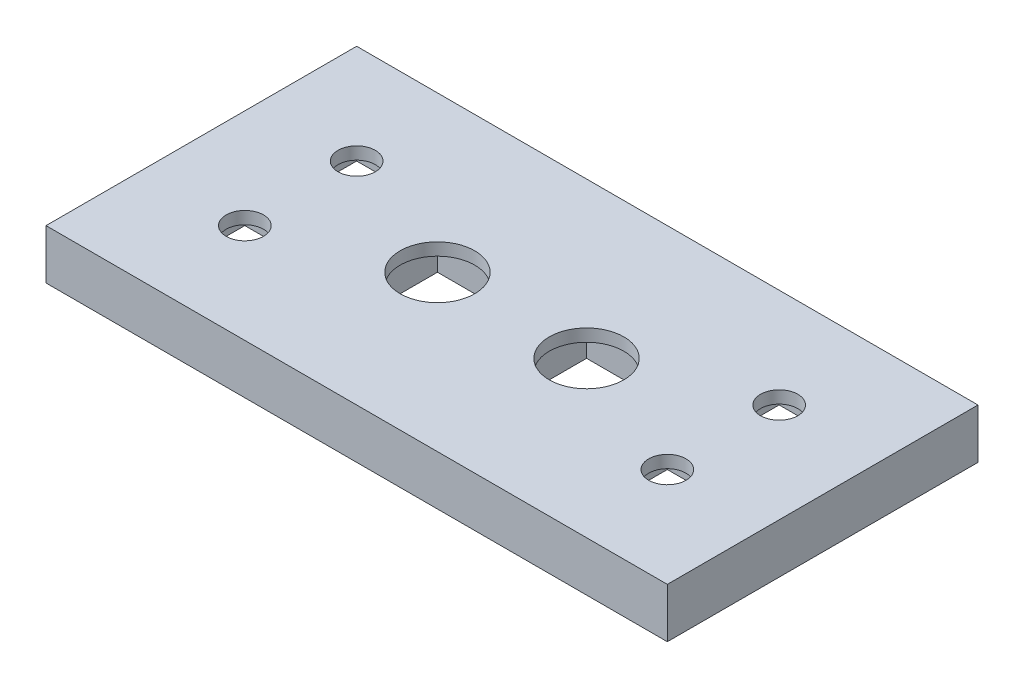
ISO-10303-21;
HEADER;
FILE_DESCRIPTION(('STEP AP214'),'2;1');
FILE_NAME('part.step','',(''),(''),'','','');
FILE_SCHEMA(('AUTOMOTIVE_DESIGN { 1 0 10303 214 1 1 1 1 }'));
ENDSEC;
DATA;
#1=APPLICATION_CONTEXT('core data for automotive mechanical design processes');
#2=APPLICATION_PROTOCOL_DEFINITION('international standard','automotive_design',2000,#1);
#3=PRODUCT_CONTEXT('',#1,'mechanical');
#4=PRODUCT('Part','Part','',(#3));
#5=PRODUCT_RELATED_PRODUCT_CATEGORY('part','',(#4));
#6=PRODUCT_DEFINITION_FORMATION('','',#4);
#7=PRODUCT_DEFINITION_CONTEXT('part definition',#1,'design');
#8=PRODUCT_DEFINITION('design','',#6,#7);
#9=PRODUCT_DEFINITION_SHAPE('','',#8);
#10=(LENGTH_UNIT() NAMED_UNIT(*) SI_UNIT(.MILLI.,.METRE.));
#11=(NAMED_UNIT(*) PLANE_ANGLE_UNIT() SI_UNIT($,.RADIAN.));
#12=(NAMED_UNIT(*) SI_UNIT($,.STERADIAN.) SOLID_ANGLE_UNIT());
#13=UNCERTAINTY_MEASURE_WITH_UNIT(LENGTH_MEASURE(1.E-05),#10,'distance_accuracy_value','');
#14=(GEOMETRIC_REPRESENTATION_CONTEXT(3) GLOBAL_UNCERTAINTY_ASSIGNED_CONTEXT((#13)) GLOBAL_UNIT_ASSIGNED_CONTEXT((#10,
#11,#12)) REPRESENTATION_CONTEXT('',''));
#15=CARTESIAN_POINT('',(0.,0.,0.));
#16=DIRECTION('',(0.,0.,1.));
#17=DIRECTION('',(1.,0.,0.));
#18=AXIS2_PLACEMENT_3D('',#15,#16,#17);
#19=CARTESIAN_POINT('',(0.,4.,0.));
#20=DIRECTION('',(0.,-1.,0.));
#21=DIRECTION('',(0.,0.,-1.));
#22=AXIS2_PLACEMENT_3D('',#19,#20,#21);
#23=PLANE('',#22);
#24=CARTESIAN_POINT('',(31.,4.,-12.5));
#25=DIRECTION('',(0.,-1.,0.));
#26=DIRECTION('',(0.,0.,-1.));
#27=AXIS2_PLACEMENT_3D('',#24,#25,#26);
#28=CIRCLE('',#27,3.);
#29=CARTESIAN_POINT('',(31.,4.,-15.5));
#30=VERTEX_POINT('',#29);
#31=EDGE_CURVE('E635',#30,#30,#28,.T.);
#32=ORIENTED_EDGE('',*,*,#31,.T.);
#33=EDGE_LOOP('',(#32));
#34=FACE_BOUND('',#33,.T.);
#35=CARTESIAN_POINT('',(42.,4.,-8.));
#36=DIRECTION('',(0.,1.,0.));
#37=DIRECTION('',(0.,0.,1.));
#38=AXIS2_PLACEMENT_3D('',#35,#36,#37);
#39=CIRCLE('',#38,1.5);
#40=CARTESIAN_POINT('',(42.,4.,-6.5));
#41=VERTEX_POINT('',#40);
#42=EDGE_CURVE('E1064',#41,#41,#39,.T.);
#43=ORIENTED_EDGE('',*,*,#42,.F.);
#44=EDGE_LOOP('',(#43));
#45=FACE_BOUND('',#44,.T.);
#46=DIRECTION('',(0.,0.,-1.));
#47=VECTOR('',#46,1.);
#48=CARTESIAN_POINT('',(0.,4.,0.));
#49=LINE('',#48,#47);
#50=CARTESIAN_POINT('',(0.,4.,0.));
#51=VERTEX_POINT('',#50);
#52=CARTESIAN_POINT('',(0.,4.,-25.));
#53=VERTEX_POINT('',#52);
#54=EDGE_CURVE('E487',#51,#53,#49,.T.);
#55=ORIENTED_EDGE('',*,*,#54,.F.);
#56=DIRECTION('',(1.,0.,0.));
#57=VECTOR('',#56,1.);
#58=CARTESIAN_POINT('',(0.,4.,0.));
#59=LINE('',#58,#57);
#60=CARTESIAN_POINT('',(50.,4.,0.));
#61=VERTEX_POINT('',#60);
#62=EDGE_CURVE('E499',#51,#61,#59,.T.);
#63=ORIENTED_EDGE('',*,*,#62,.T.);
#64=DIRECTION('',(0.,0.,-1.));
#65=VECTOR('',#64,1.);
#66=CARTESIAN_POINT('',(50.,4.,0.));
#67=LINE('',#66,#65);
#68=CARTESIAN_POINT('',(50.,4.,-25.));
#69=VERTEX_POINT('',#68);
#70=EDGE_CURVE('E496',#61,#69,#67,.T.);
#71=ORIENTED_EDGE('',*,*,#70,.T.);
#72=DIRECTION('',(1.,0.,0.));
#73=VECTOR('',#72,1.);
#74=CARTESIAN_POINT('',(0.,4.,-25.));
#75=LINE('',#74,#73);
#76=EDGE_CURVE('E491',#53,#69,#75,.T.);
#77=ORIENTED_EDGE('',*,*,#76,.F.);
#78=EDGE_LOOP('',(#55,#63,#71,#77));
#79=FACE_BOUND('',#78,.T.);
#80=CARTESIAN_POINT('',(8.,4.,-17.));
#81=DIRECTION('',(0.,1.,0.));
#82=DIRECTION('',(0.,0.,1.));
#83=AXIS2_PLACEMENT_3D('',#80,#81,#82);
#84=CIRCLE('',#83,1.5);
#85=CARTESIAN_POINT('',(8.,4.,-15.5));
#86=VERTEX_POINT('',#85);
#87=EDGE_CURVE('E619',#86,#86,#84,.T.);
#88=ORIENTED_EDGE('',*,*,#87,.F.);
#89=EDGE_LOOP('',(#88));
#90=FACE_BOUND('',#89,.T.);
#91=CARTESIAN_POINT('',(42.,4.,-17.));
#92=DIRECTION('',(0.,-1.,0.));
#93=DIRECTION('',(0.,0.,-1.));
#94=AXIS2_PLACEMENT_3D('',#91,#92,#93);
#95=CIRCLE('',#94,1.5);
#96=CARTESIAN_POINT('',(42.,4.,-18.5));
#97=VERTEX_POINT('',#96);
#98=EDGE_CURVE('E623',#97,#97,#95,.T.);
#99=ORIENTED_EDGE('',*,*,#98,.T.);
#100=EDGE_LOOP('',(#99));
#101=FACE_BOUND('',#100,.T.);
#102=CARTESIAN_POINT('',(19.,4.,-12.5));
#103=DIRECTION('',(0.,1.,0.));
#104=DIRECTION('',(0.,0.,1.));
#105=AXIS2_PLACEMENT_3D('',#102,#103,#104);
#106=CIRCLE('',#105,3.);
#107=CARTESIAN_POINT('',(19.,4.,-9.5));
#108=VERTEX_POINT('',#107);
#109=EDGE_CURVE('E627',#108,#108,#106,.T.);
#110=ORIENTED_EDGE('',*,*,#109,.F.);
#111=EDGE_LOOP('',(#110));
#112=FACE_BOUND('',#111,.T.);
#113=CARTESIAN_POINT('',(8.,4.,-8.));
#114=DIRECTION('',(0.,-1.,0.));
#115=DIRECTION('',(0.,0.,-1.));
#116=AXIS2_PLACEMENT_3D('',#113,#114,#115);
#117=CIRCLE('',#116,1.5);
#118=CARTESIAN_POINT('',(8.,4.,-9.5));
#119=VERTEX_POINT('',#118);
#120=EDGE_CURVE('E630',#119,#119,#117,.T.);
#121=ORIENTED_EDGE('',*,*,#120,.T.);
#122=EDGE_LOOP('',(#121));
#123=FACE_BOUND('',#122,.T.);
#124=ADVANCED_FACE('F39',(#34,#45,#79,#90,#101,#112,#123),#23,.F.);
#125=CARTESIAN_POINT('',(0.,0.,0.));
#126=DIRECTION('',(0.,-1.,0.));
#127=DIRECTION('',(0.,0.,-1.));
#128=AXIS2_PLACEMENT_3D('',#125,#126,#127);
#129=PLANE('',#128);
#130=DIRECTION('',(0.,0.,-1.));
#131=VECTOR('',#130,1.);
#132=CARTESIAN_POINT('',(38.,0.,0.));
#133=LINE('',#132,#131);
#134=CARTESIAN_POINT('',(38.,0.,-13.));
#135=VERTEX_POINT('',#134);
#136=CARTESIAN_POINT('',(38.,0.,-21.));
#137=VERTEX_POINT('',#136);
#138=EDGE_CURVE('E57',#135,#137,#133,.T.);
#139=ORIENTED_EDGE('',*,*,#138,.F.);
#140=DIRECTION('',(-1.,0.,0.));
#141=VECTOR('',#140,1.);
#142=CARTESIAN_POINT('',(0.,0.,-13.));
#143=LINE('',#142,#141);
#144=CARTESIAN_POINT('',(46.,0.,-13.));
#145=VERTEX_POINT('',#144);
#146=EDGE_CURVE('E298',#145,#135,#143,.T.);
#147=ORIENTED_EDGE('',*,*,#146,.F.);
#148=DIRECTION('',(0.,0.,-1.));
#149=VECTOR('',#148,1.);
#150=CARTESIAN_POINT('',(46.,0.,0.));
#151=LINE('',#150,#149);
#152=CARTESIAN_POINT('',(46.,0.,-21.));
#153=VERTEX_POINT('',#152);
#154=EDGE_CURVE('E293',#145,#153,#151,.T.);
#155=ORIENTED_EDGE('',*,*,#154,.T.);
#156=DIRECTION('',(-1.,0.,0.));
#157=VECTOR('',#156,1.);
#158=CARTESIAN_POINT('',(0.,0.,-21.));
#159=LINE('',#158,#157);
#160=EDGE_CURVE('E289',#153,#137,#159,.T.);
#161=ORIENTED_EDGE('',*,*,#160,.T.);
#162=EDGE_LOOP('',(#139,#147,#155,#161));
#163=FACE_BOUND('',#162,.T.);
#164=DIRECTION('',(-1.,0.,0.));
#165=VECTOR('',#164,1.);
#166=CARTESIAN_POINT('',(0.,0.,-8.5));
#167=LINE('',#166,#165);
#168=CARTESIAN_POINT('',(35.,0.,-8.5));
#169=VERTEX_POINT('',#168);
#170=CARTESIAN_POINT('',(27.,0.,-8.5));
#171=VERTEX_POINT('',#170);
#172=EDGE_CURVE('E65',#169,#171,#167,.T.);
#173=ORIENTED_EDGE('',*,*,#172,.F.);
#174=DIRECTION('',(0.,0.,-1.));
#175=VECTOR('',#174,1.);
#176=CARTESIAN_POINT('',(35.,0.,0.));
#177=LINE('',#176,#175);
#178=CARTESIAN_POINT('',(35.,0.,-16.5));
#179=VERTEX_POINT('',#178);
#180=EDGE_CURVE('E340',#169,#179,#177,.T.);
#181=ORIENTED_EDGE('',*,*,#180,.T.);
#182=DIRECTION('',(-1.,0.,0.));
#183=VECTOR('',#182,1.);
#184=CARTESIAN_POINT('',(0.,0.,-16.5));
#185=LINE('',#184,#183);
#186=CARTESIAN_POINT('',(27.,0.,-16.5));
#187=VERTEX_POINT('',#186);
#188=EDGE_CURVE('E335',#179,#187,#185,.T.);
#189=ORIENTED_EDGE('',*,*,#188,.T.);
#190=DIRECTION('',(0.,0.,-1.));
#191=VECTOR('',#190,1.);
#192=CARTESIAN_POINT('',(27.,0.,0.));
#193=LINE('',#192,#191);
#194=EDGE_CURVE('E331',#171,#187,#193,.T.);
#195=ORIENTED_EDGE('',*,*,#194,.F.);
#196=EDGE_LOOP('',(#173,#181,#189,#195));
#197=FACE_BOUND('',#196,.T.);
#198=DIRECTION('',(1.,0.,0.));
#199=VECTOR('',#198,1.);
#200=CARTESIAN_POINT('',(0.,0.,-12.));
#201=LINE('',#200,#199);
#202=CARTESIAN_POINT('',(4.,0.,-12.));
#203=VERTEX_POINT('',#202);
#204=CARTESIAN_POINT('',(12.,0.,-12.));
#205=VERTEX_POINT('',#204);
#206=EDGE_CURVE('E321',#203,#205,#201,.T.);
#207=ORIENTED_EDGE('',*,*,#206,.F.);
#208=DIRECTION('',(0.,0.,1.));
#209=VECTOR('',#208,1.);
#210=CARTESIAN_POINT('',(4.,0.,0.));
#211=LINE('',#210,#209);
#212=CARTESIAN_POINT('',(4.,0.,-4.));
#213=VERTEX_POINT('',#212);
#214=EDGE_CURVE('E382',#203,#213,#211,.T.);
#215=ORIENTED_EDGE('',*,*,#214,.T.);
#216=DIRECTION('',(1.,0.,0.));
#217=VECTOR('',#216,1.);
#218=CARTESIAN_POINT('',(0.,0.,-4.));
#219=LINE('',#218,#217);
#220=CARTESIAN_POINT('',(12.,0.,-4.));
#221=VERTEX_POINT('',#220);
#222=EDGE_CURVE('E377',#213,#221,#219,.T.);
#223=ORIENTED_EDGE('',*,*,#222,.T.);
#224=DIRECTION('',(0.,0.,1.));
#225=VECTOR('',#224,1.);
#226=CARTESIAN_POINT('',(12.,0.,0.));
#227=LINE('',#226,#225);
#228=EDGE_CURVE('E373',#205,#221,#227,.T.);
#229=ORIENTED_EDGE('',*,*,#228,.F.);
#230=EDGE_LOOP('',(#207,#215,#223,#229));
#231=FACE_BOUND('',#230,.T.);
#232=DIRECTION('',(-1.,0.,0.));
#233=VECTOR('',#232,1.);
#234=CARTESIAN_POINT('',(0.,0.,-4.));
#235=LINE('',#234,#233);
#236=CARTESIAN_POINT('',(46.,0.,-4.));
#237=VERTEX_POINT('',#236);
#238=CARTESIAN_POINT('',(38.,0.,-4.));
#239=VERTEX_POINT('',#238);
#240=EDGE_CURVE('E304',#237,#239,#235,.T.);
#241=ORIENTED_EDGE('',*,*,#240,.F.);
#242=DIRECTION('',(0.,0.,1.));
#243=VECTOR('',#242,1.);
#244=CARTESIAN_POINT('',(46.,0.,0.));
#245=LINE('',#244,#243);
#246=CARTESIAN_POINT('',(46.,0.,-12.));
#247=VERTEX_POINT('',#246);
#248=EDGE_CURVE('E462',#247,#237,#245,.T.);
#249=ORIENTED_EDGE('',*,*,#248,.F.);
#250=DIRECTION('',(-1.,0.,0.));
#251=VECTOR('',#250,1.);
#252=CARTESIAN_POINT('',(0.,0.,-12.));
#253=LINE('',#252,#251);
#254=CARTESIAN_POINT('',(38.,0.,-12.));
#255=VERTEX_POINT('',#254);
#256=EDGE_CURVE('E466',#247,#255,#253,.T.);
#257=ORIENTED_EDGE('',*,*,#256,.T.);
#258=DIRECTION('',(0.,0.,1.));
#259=VECTOR('',#258,1.);
#260=CARTESIAN_POINT('',(38.,0.,0.));
#261=LINE('',#260,#259);
#262=EDGE_CURVE('E448',#255,#239,#261,.T.);
#263=ORIENTED_EDGE('',*,*,#262,.T.);
#264=EDGE_LOOP('',(#241,#249,#257,#263));
#265=FACE_BOUND('',#264,.T.);
#266=DIRECTION('',(0.,0.,-1.));
#267=VECTOR('',#266,1.);
#268=CARTESIAN_POINT('',(0.,0.,0.));
#269=LINE('',#268,#267);
#270=CARTESIAN_POINT('',(0.,0.,0.));
#271=VERTEX_POINT('',#270);
#272=CARTESIAN_POINT('',(0.,0.,-25.));
#273=VERTEX_POINT('',#272);
#274=EDGE_CURVE('E486',#271,#273,#269,.T.);
#275=ORIENTED_EDGE('',*,*,#274,.T.);
#276=DIRECTION('',(1.,0.,0.));
#277=VECTOR('',#276,1.);
#278=CARTESIAN_POINT('',(0.,0.,-25.));
#279=LINE('',#278,#277);
#280=CARTESIAN_POINT('',(50.,0.,-25.));
#281=VERTEX_POINT('',#280);
#282=EDGE_CURVE('E506',#273,#281,#279,.T.);
#283=ORIENTED_EDGE('',*,*,#282,.T.);
#284=DIRECTION('',(0.,0.,-1.));
#285=VECTOR('',#284,1.);
#286=CARTESIAN_POINT('',(50.,0.,0.));
#287=LINE('',#286,#285);
#288=CARTESIAN_POINT('',(50.,0.,0.));
#289=VERTEX_POINT('',#288);
#290=EDGE_CURVE('E510',#289,#281,#287,.T.);
#291=ORIENTED_EDGE('',*,*,#290,.F.);
#292=DIRECTION('',(1.,0.,0.));
#293=VECTOR('',#292,1.);
#294=CARTESIAN_POINT('',(0.,0.,0.));
#295=LINE('',#294,#293);
#296=EDGE_CURVE('E492',#271,#289,#295,.T.);
#297=ORIENTED_EDGE('',*,*,#296,.F.);
#298=EDGE_LOOP('',(#275,#283,#291,#297));
#299=FACE_BOUND('',#298,.T.);
#300=DIRECTION('',(0.,0.,-1.));
#301=VECTOR('',#300,1.);
#302=CARTESIAN_POINT('',(4.,0.,-13.));
#303=LINE('',#302,#301);
#304=CARTESIAN_POINT('',(4.,0.,-13.));
#305=VERTEX_POINT('',#304);
#306=CARTESIAN_POINT('',(4.,0.,-21.));
#307=VERTEX_POINT('',#306);
#308=EDGE_CURVE('E245',#305,#307,#303,.T.);
#309=ORIENTED_EDGE('',*,*,#308,.F.);
#310=DIRECTION('',(1.,0.,0.));
#311=VECTOR('',#310,1.);
#312=CARTESIAN_POINT('',(4.,0.,-13.));
#313=LINE('',#312,#311);
#314=CARTESIAN_POINT('',(12.,0.,-13.));
#315=VERTEX_POINT('',#314);
#316=EDGE_CURVE('E258',#305,#315,#313,.T.);
#317=ORIENTED_EDGE('',*,*,#316,.T.);
#318=DIRECTION('',(0.,0.,-1.));
#319=VECTOR('',#318,1.);
#320=CARTESIAN_POINT('',(12.,0.,-13.));
#321=LINE('',#320,#319);
#322=CARTESIAN_POINT('',(12.,0.,-21.));
#323=VERTEX_POINT('',#322);
#324=EDGE_CURVE('E254',#315,#323,#321,.T.);
#325=ORIENTED_EDGE('',*,*,#324,.T.);
#326=DIRECTION('',(1.,0.,0.));
#327=VECTOR('',#326,1.);
#328=CARTESIAN_POINT('',(4.,0.,-21.));
#329=LINE('',#328,#327);
#330=EDGE_CURVE('E232',#307,#323,#329,.T.);
#331=ORIENTED_EDGE('',*,*,#330,.F.);
#332=EDGE_LOOP('',(#309,#317,#325,#331));
#333=FACE_BOUND('',#332,.T.);
#334=DIRECTION('',(0.,0.,-1.));
#335=VECTOR('',#334,1.);
#336=CARTESIAN_POINT('',(15.,0.,-8.5));
#337=LINE('',#336,#335);
#338=CARTESIAN_POINT('',(15.,0.,-8.5));
#339=VERTEX_POINT('',#338);
#340=CARTESIAN_POINT('',(15.,0.,-16.5));
#341=VERTEX_POINT('',#340);
#342=EDGE_CURVE('E414',#339,#341,#337,.T.);
#343=ORIENTED_EDGE('',*,*,#342,.F.);
#344=DIRECTION('',(1.,0.,0.));
#345=VECTOR('',#344,1.);
#346=CARTESIAN_POINT('',(15.,0.,-8.5));
#347=LINE('',#346,#345);
#348=CARTESIAN_POINT('',(23.,0.,-8.5));
#349=VERTEX_POINT('',#348);
#350=EDGE_CURVE('E362',#339,#349,#347,.T.);
#351=ORIENTED_EDGE('',*,*,#350,.T.);
#352=DIRECTION('',(0.,0.,-1.));
#353=VECTOR('',#352,1.);
#354=CARTESIAN_POINT('',(23.,0.,-8.5));
#355=LINE('',#354,#353);
#356=CARTESIAN_POINT('',(23.,0.,-16.5));
#357=VERTEX_POINT('',#356);
#358=EDGE_CURVE('E423',#349,#357,#355,.T.);
#359=ORIENTED_EDGE('',*,*,#358,.T.);
#360=DIRECTION('',(1.,0.,0.));
#361=VECTOR('',#360,1.);
#362=CARTESIAN_POINT('',(15.,0.,-16.5));
#363=LINE('',#362,#361);
#364=EDGE_CURVE('E418',#341,#357,#363,.T.);
#365=ORIENTED_EDGE('',*,*,#364,.F.);
#366=EDGE_LOOP('',(#343,#351,#359,#365));
#367=FACE_BOUND('',#366,.T.);
#368=ADVANCED_FACE('F252',(#163,#197,#231,#265,#299,#333,#367),#129,.T.);
#369=CARTESIAN_POINT('',(0.,4.,0.));
#370=DIRECTION('',(-1.,0.,0.));
#371=DIRECTION('',(0.,0.,1.));
#372=AXIS2_PLACEMENT_3D('',#369,#370,#371);
#373=PLANE('',#372);
#374=ORIENTED_EDGE('',*,*,#274,.F.);
#375=DIRECTION('',(0.,-1.,0.));
#376=VECTOR('',#375,1.);
#377=CARTESIAN_POINT('',(0.,4.,0.));
#378=LINE('',#377,#376);
#379=EDGE_CURVE('E11',#51,#271,#378,.T.);
#380=ORIENTED_EDGE('',*,*,#379,.F.);
#381=ORIENTED_EDGE('',*,*,#54,.T.);
#382=DIRECTION('',(0.,-1.,0.));
#383=VECTOR('',#382,1.);
#384=CARTESIAN_POINT('',(0.,4.,-25.));
#385=LINE('',#384,#383);
#386=EDGE_CURVE('E502',#53,#273,#385,.T.);
#387=ORIENTED_EDGE('',*,*,#386,.T.);
#388=EDGE_LOOP('',(#374,#380,#381,#387));
#389=FACE_BOUND('',#388,.T.);
#390=ADVANCED_FACE('F41',(#389),#373,.T.);
#391=CARTESIAN_POINT('',(0.,4.,0.));
#392=DIRECTION('',(0.,0.,-1.));
#393=DIRECTION('',(-1.,0.,0.));
#394=AXIS2_PLACEMENT_3D('',#391,#392,#393);
#395=PLANE('',#394);
#396=ORIENTED_EDGE('',*,*,#296,.T.);
#397=DIRECTION('',(0.,-1.,0.));
#398=VECTOR('',#397,1.);
#399=CARTESIAN_POINT('',(50.,4.,0.));
#400=LINE('',#399,#398);
#401=EDGE_CURVE('E49',#61,#289,#400,.T.);
#402=ORIENTED_EDGE('',*,*,#401,.F.);
#403=ORIENTED_EDGE('',*,*,#62,.F.);
#404=ORIENTED_EDGE('',*,*,#379,.T.);
#405=EDGE_LOOP('',(#396,#402,#403,#404));
#406=FACE_BOUND('',#405,.T.);
#407=ADVANCED_FACE('F587',(#406),#395,.F.);
#408=CARTESIAN_POINT('',(50.,4.,0.));
#409=DIRECTION('',(-1.,0.,0.));
#410=DIRECTION('',(0.,0.,1.));
#411=AXIS2_PLACEMENT_3D('',#408,#409,#410);
#412=PLANE('',#411);
#413=ORIENTED_EDGE('',*,*,#290,.T.);
#414=DIRECTION('',(0.,-1.,0.));
#415=VECTOR('',#414,1.);
#416=CARTESIAN_POINT('',(50.,4.,-25.));
#417=LINE('',#416,#415);
#418=EDGE_CURVE('E519',#69,#281,#417,.T.);
#419=ORIENTED_EDGE('',*,*,#418,.F.);
#420=ORIENTED_EDGE('',*,*,#70,.F.);
#421=ORIENTED_EDGE('',*,*,#401,.T.);
#422=EDGE_LOOP('',(#413,#419,#420,#421));
#423=FACE_BOUND('',#422,.T.);
#424=ADVANCED_FACE('F590',(#423),#412,.F.);
#425=CARTESIAN_POINT('',(0.,4.,-25.));
#426=DIRECTION('',(0.,0.,-1.));
#427=DIRECTION('',(-1.,0.,0.));
#428=AXIS2_PLACEMENT_3D('',#425,#426,#427);
#429=PLANE('',#428);
#430=ORIENTED_EDGE('',*,*,#282,.F.);
#431=ORIENTED_EDGE('',*,*,#386,.F.);
#432=ORIENTED_EDGE('',*,*,#76,.T.);
#433=ORIENTED_EDGE('',*,*,#418,.T.);
#434=EDGE_LOOP('',(#430,#431,#432,#433));
#435=FACE_BOUND('',#434,.T.);
#436=ADVANCED_FACE('F593',(#435),#429,.T.);
#437=CARTESIAN_POINT('',(0.,3.,-4.));
#438=DIRECTION('',(0.,0.,1.));
#439=DIRECTION('',(1.,0.,0.));
#440=AXIS2_PLACEMENT_3D('',#437,#438,#439);
#441=PLANE('',#440);
#442=ORIENTED_EDGE('',*,*,#240,.T.);
#443=DIRECTION('',(0.,-1.,0.));
#444=VECTOR('',#443,1.);
#445=CARTESIAN_POINT('',(38.,3.,-4.));
#446=LINE('',#445,#444);
#447=CARTESIAN_POINT('',(38.,3.,-4.));
#448=VERTEX_POINT('',#447);
#449=EDGE_CURVE('E459',#448,#239,#446,.T.);
#450=ORIENTED_EDGE('',*,*,#449,.F.);
#451=DIRECTION('',(-1.,0.,0.));
#452=VECTOR('',#451,1.);
#453=CARTESIAN_POINT('',(0.,3.,-4.));
#454=LINE('',#453,#452);
#455=CARTESIAN_POINT('',(46.,3.,-4.));
#456=VERTEX_POINT('',#455);
#457=EDGE_CURVE('E443',#456,#448,#454,.T.);
#458=ORIENTED_EDGE('',*,*,#457,.F.);
#459=DIRECTION('',(0.,-1.,0.));
#460=VECTOR('',#459,1.);
#461=CARTESIAN_POINT('',(46.,3.,-4.));
#462=LINE('',#461,#460);
#463=EDGE_CURVE('E483',#456,#237,#462,.T.);
#464=ORIENTED_EDGE('',*,*,#463,.T.);
#465=EDGE_LOOP('',(#442,#450,#458,#464));
#466=FACE_BOUND('',#465,.T.);
#467=ADVANCED_FACE('F584',(#466),#441,.F.);
#468=CARTESIAN_POINT('',(46.,3.,0.));
#469=DIRECTION('',(1.,0.,0.));
#470=DIRECTION('',(0.,0.,-1.));
#471=AXIS2_PLACEMENT_3D('',#468,#469,#470);
#472=PLANE('',#471);
#473=ORIENTED_EDGE('',*,*,#248,.T.);
#474=ORIENTED_EDGE('',*,*,#463,.F.);
#475=DIRECTION('',(0.,0.,1.));
#476=VECTOR('',#475,1.);
#477=CARTESIAN_POINT('',(46.,3.,0.));
#478=LINE('',#477,#476);
#479=CARTESIAN_POINT('',(46.,3.,-12.));
#480=VERTEX_POINT('',#479);
#481=EDGE_CURVE('E447',#480,#456,#478,.T.);
#482=ORIENTED_EDGE('',*,*,#481,.F.);
#483=DIRECTION('',(0.,-1.,0.));
#484=VECTOR('',#483,1.);
#485=CARTESIAN_POINT('',(46.,3.,-12.));
#486=LINE('',#485,#484);
#487=EDGE_CURVE('E480',#480,#247,#486,.T.);
#488=ORIENTED_EDGE('',*,*,#487,.T.);
#489=EDGE_LOOP('',(#473,#474,#482,#488));
#490=FACE_BOUND('',#489,.T.);
#491=ADVANCED_FACE('F600',(#490),#472,.F.);
#492=CARTESIAN_POINT('',(0.,3.,-12.));
#493=DIRECTION('',(0.,0.,1.));
#494=DIRECTION('',(1.,0.,0.));
#495=AXIS2_PLACEMENT_3D('',#492,#493,#494);
#496=PLANE('',#495);
#497=ORIENTED_EDGE('',*,*,#256,.F.);
#498=ORIENTED_EDGE('',*,*,#487,.F.);
#499=DIRECTION('',(-1.,0.,0.));
#500=VECTOR('',#499,1.);
#501=CARTESIAN_POINT('',(0.,3.,-12.));
#502=LINE('',#501,#500);
#503=CARTESIAN_POINT('',(38.,3.,-12.));
#504=VERTEX_POINT('',#503);
#505=EDGE_CURVE('E452',#480,#504,#502,.T.);
#506=ORIENTED_EDGE('',*,*,#505,.T.);
#507=DIRECTION('',(0.,-1.,0.));
#508=VECTOR('',#507,1.);
#509=CARTESIAN_POINT('',(38.,3.,-12.));
#510=LINE('',#509,#508);
#511=EDGE_CURVE('E476',#504,#255,#510,.T.);
#512=ORIENTED_EDGE('',*,*,#511,.T.);
#513=EDGE_LOOP('',(#497,#498,#506,#512));
#514=FACE_BOUND('',#513,.T.);
#515=ADVANCED_FACE('F762',(#514),#496,.T.);
#516=CARTESIAN_POINT('',(38.,3.,0.));
#517=DIRECTION('',(1.,0.,0.));
#518=DIRECTION('',(0.,0.,-1.));
#519=AXIS2_PLACEMENT_3D('',#516,#517,#518);
#520=PLANE('',#519);
#521=ORIENTED_EDGE('',*,*,#262,.F.);
#522=ORIENTED_EDGE('',*,*,#511,.F.);
#523=DIRECTION('',(0.,0.,1.));
#524=VECTOR('',#523,1.);
#525=CARTESIAN_POINT('',(38.,3.,0.));
#526=LINE('',#525,#524);
#527=EDGE_CURVE('E456',#504,#448,#526,.T.);
#528=ORIENTED_EDGE('',*,*,#527,.T.);
#529=ORIENTED_EDGE('',*,*,#449,.T.);
#530=EDGE_LOOP('',(#521,#522,#528,#529));
#531=FACE_BOUND('',#530,.T.);
#532=ADVANCED_FACE('F569',(#531),#520,.T.);
#533=CARTESIAN_POINT('',(0.,3.,0.));
#534=DIRECTION('',(0.,1.,0.));
#535=DIRECTION('',(0.,0.,1.));
#536=AXIS2_PLACEMENT_3D('',#533,#534,#535);
#537=PLANE('',#536);
#538=CARTESIAN_POINT('',(42.,3.,-8.));
#539=DIRECTION('',(0.,1.,0.));
#540=DIRECTION('',(0.,0.,1.));
#541=AXIS2_PLACEMENT_3D('',#538,#539,#540);
#542=CIRCLE('',#541,1.5);
#543=CARTESIAN_POINT('',(42.,3.,-6.5));
#544=VERTEX_POINT('',#543);
#545=EDGE_CURVE('E532',#544,#544,#542,.F.);
#546=ORIENTED_EDGE('',*,*,#545,.F.);
#547=EDGE_LOOP('',(#546));
#548=FACE_BOUND('',#547,.T.);
#549=ORIENTED_EDGE('',*,*,#457,.T.);
#550=ORIENTED_EDGE('',*,*,#527,.F.);
#551=ORIENTED_EDGE('',*,*,#505,.F.);
#552=ORIENTED_EDGE('',*,*,#481,.T.);
#553=EDGE_LOOP('',(#549,#550,#551,#552));
#554=FACE_BOUND('',#553,.T.);
#555=ADVANCED_FACE('F562',(#548,#554),#537,.F.);
#556=CARTESIAN_POINT('',(4.,3.,-13.));
#557=DIRECTION('',(0.,0.,-1.));
#558=DIRECTION('',(-1.,0.,0.));
#559=AXIS2_PLACEMENT_3D('',#556,#557,#558);
#560=PLANE('',#559);
#561=ORIENTED_EDGE('',*,*,#316,.F.);
#562=DIRECTION('',(0.,-1.,0.));
#563=VECTOR('',#562,1.);
#564=CARTESIAN_POINT('',(4.,3.,-13.));
#565=LINE('',#564,#563);
#566=CARTESIAN_POINT('',(4.,3.,-13.));
#567=VERTEX_POINT('',#566);
#568=EDGE_CURVE('E240',#567,#305,#565,.T.);
#569=ORIENTED_EDGE('',*,*,#568,.F.);
#570=DIRECTION('',(1.,0.,0.));
#571=VECTOR('',#570,1.);
#572=CARTESIAN_POINT('',(4.,3.,-13.));
#573=LINE('',#572,#571);
#574=CARTESIAN_POINT('',(12.,3.,-13.));
#575=VERTEX_POINT('',#574);
#576=EDGE_CURVE('E250',#567,#575,#573,.T.);
#577=ORIENTED_EDGE('',*,*,#576,.T.);
#578=DIRECTION('',(0.,-1.,0.));
#579=VECTOR('',#578,1.);
#580=CARTESIAN_POINT('',(12.,3.,-13.));
#581=LINE('',#580,#579);
#582=EDGE_CURVE('E547',#575,#315,#581,.T.);
#583=ORIENTED_EDGE('',*,*,#582,.T.);
#584=EDGE_LOOP('',(#561,#569,#577,#583));
#585=FACE_BOUND('',#584,.T.);
#586=ADVANCED_FACE('F560',(#585),#560,.T.);
#587=CARTESIAN_POINT('',(12.,3.,-13.));
#588=DIRECTION('',(-1.,0.,0.));
#589=DIRECTION('',(0.,0.,1.));
#590=AXIS2_PLACEMENT_3D('',#587,#588,#589);
#591=PLANE('',#590);
#592=ORIENTED_EDGE('',*,*,#324,.F.);
#593=ORIENTED_EDGE('',*,*,#582,.F.);
#594=DIRECTION('',(0.,0.,-1.));
#595=VECTOR('',#594,1.);
#596=CARTESIAN_POINT('',(12.,3.,-13.));
#597=LINE('',#596,#595);
#598=CARTESIAN_POINT('',(12.,3.,-21.));
#599=VERTEX_POINT('',#598);
#600=EDGE_CURVE('E270',#575,#599,#597,.T.);
#601=ORIENTED_EDGE('',*,*,#600,.T.);
#602=DIRECTION('',(0.,-1.,0.));
#603=VECTOR('',#602,1.);
#604=CARTESIAN_POINT('',(12.,3.,-21.));
#605=LINE('',#604,#603);
#606=EDGE_CURVE('E241',#599,#323,#605,.T.);
#607=ORIENTED_EDGE('',*,*,#606,.T.);
#608=EDGE_LOOP('',(#592,#593,#601,#607));
#609=FACE_BOUND('',#608,.T.);
#610=ADVANCED_FACE('F554',(#609),#591,.T.);
#611=CARTESIAN_POINT('',(4.,3.,-21.));
#612=DIRECTION('',(0.,0.,-1.));
#613=DIRECTION('',(-1.,0.,0.));
#614=AXIS2_PLACEMENT_3D('',#611,#612,#613);
#615=PLANE('',#614);
#616=ORIENTED_EDGE('',*,*,#330,.T.);
#617=ORIENTED_EDGE('',*,*,#606,.F.);
#618=DIRECTION('',(1.,0.,0.));
#619=VECTOR('',#618,1.);
#620=CARTESIAN_POINT('',(4.,3.,-21.));
#621=LINE('',#620,#619);
#622=CARTESIAN_POINT('',(4.,3.,-21.));
#623=VERTEX_POINT('',#622);
#624=EDGE_CURVE('E235',#623,#599,#621,.T.);
#625=ORIENTED_EDGE('',*,*,#624,.F.);
#626=DIRECTION('',(0.,-1.,0.));
#627=VECTOR('',#626,1.);
#628=CARTESIAN_POINT('',(4.,3.,-21.));
#629=LINE('',#628,#627);
#630=EDGE_CURVE('E227',#623,#307,#629,.T.);
#631=ORIENTED_EDGE('',*,*,#630,.T.);
#632=EDGE_LOOP('',(#616,#617,#625,#631));
#633=FACE_BOUND('',#632,.T.);
#634=ADVANCED_FACE('F229',(#633),#615,.F.);
#635=CARTESIAN_POINT('',(4.,3.,-13.));
#636=DIRECTION('',(-1.,0.,0.));
#637=DIRECTION('',(0.,0.,1.));
#638=AXIS2_PLACEMENT_3D('',#635,#636,#637);
#639=PLANE('',#638);
#640=ORIENTED_EDGE('',*,*,#308,.T.);
#641=ORIENTED_EDGE('',*,*,#630,.F.);
#642=DIRECTION('',(0.,0.,-1.));
#643=VECTOR('',#642,1.);
#644=CARTESIAN_POINT('',(4.,3.,-13.));
#645=LINE('',#644,#643);
#646=EDGE_CURVE('E265',#567,#623,#645,.T.);
#647=ORIENTED_EDGE('',*,*,#646,.F.);
#648=ORIENTED_EDGE('',*,*,#568,.T.);
#649=EDGE_LOOP('',(#640,#641,#647,#648));
#650=FACE_BOUND('',#649,.T.);
#651=ADVANCED_FACE('F246',(#650),#639,.F.);
#652=CARTESIAN_POINT('',(0.,3.,0.));
#653=DIRECTION('',(0.,1.,0.));
#654=DIRECTION('',(0.,0.,1.));
#655=AXIS2_PLACEMENT_3D('',#652,#653,#654);
#656=PLANE('',#655);
#657=CARTESIAN_POINT('',(8.,3.,-17.));
#658=DIRECTION('',(0.,1.,0.));
#659=DIRECTION('',(0.,0.,1.));
#660=AXIS2_PLACEMENT_3D('',#657,#658,#659);
#661=CIRCLE('',#660,1.5);
#662=CARTESIAN_POINT('',(8.,3.,-15.5));
#663=VERTEX_POINT('',#662);
#664=EDGE_CURVE('E43',#663,#663,#661,.F.);
#665=ORIENTED_EDGE('',*,*,#664,.F.);
#666=EDGE_LOOP('',(#665));
#667=FACE_BOUND('',#666,.T.);
#668=ORIENTED_EDGE('',*,*,#576,.F.);
#669=ORIENTED_EDGE('',*,*,#646,.T.);
#670=ORIENTED_EDGE('',*,*,#624,.T.);
#671=ORIENTED_EDGE('',*,*,#600,.F.);
#672=EDGE_LOOP('',(#668,#669,#670,#671));
#673=FACE_BOUND('',#672,.T.);
#674=ADVANCED_FACE('F558',(#667,#673),#656,.F.);
#675=CARTESIAN_POINT('',(15.,3.,-8.5));
#676=DIRECTION('',(0.,0.,-1.));
#677=DIRECTION('',(-1.,0.,0.));
#678=AXIS2_PLACEMENT_3D('',#675,#676,#677);
#679=PLANE('',#678);
#680=ORIENTED_EDGE('',*,*,#350,.F.);
#681=DIRECTION('',(0.,-1.,0.));
#682=VECTOR('',#681,1.);
#683=CARTESIAN_POINT('',(15.,3.,-8.5));
#684=LINE('',#683,#682);
#685=CARTESIAN_POINT('',(15.,3.,-8.5));
#686=VERTEX_POINT('',#685);
#687=EDGE_CURVE('E409',#686,#339,#684,.T.);
#688=ORIENTED_EDGE('',*,*,#687,.F.);
#689=DIRECTION('',(1.,0.,0.));
#690=VECTOR('',#689,1.);
#691=CARTESIAN_POINT('',(15.,3.,-8.5));
#692=LINE('',#691,#690);
#693=CARTESIAN_POINT('',(23.,3.,-8.5));
#694=VERTEX_POINT('',#693);
#695=EDGE_CURVE('E419',#686,#694,#692,.T.);
#696=ORIENTED_EDGE('',*,*,#695,.T.);
#697=DIRECTION('',(0.,-1.,0.));
#698=VECTOR('',#697,1.);
#699=CARTESIAN_POINT('',(23.,3.,-8.5));
#700=LINE('',#699,#698);
#701=EDGE_CURVE('E264',#694,#349,#700,.T.);
#702=ORIENTED_EDGE('',*,*,#701,.T.);
#703=EDGE_LOOP('',(#680,#688,#696,#702));
#704=FACE_BOUND('',#703,.T.);
#705=ADVANCED_FACE('F680',(#704),#679,.T.);
#706=CARTESIAN_POINT('',(23.,3.,-8.5));
#707=DIRECTION('',(-1.,0.,0.));
#708=DIRECTION('',(0.,0.,1.));
#709=AXIS2_PLACEMENT_3D('',#706,#707,#708);
#710=PLANE('',#709);
#711=ORIENTED_EDGE('',*,*,#358,.F.);
#712=ORIENTED_EDGE('',*,*,#701,.F.);
#713=DIRECTION('',(0.,0.,-1.));
#714=VECTOR('',#713,1.);
#715=CARTESIAN_POINT('',(23.,3.,-8.5));
#716=LINE('',#715,#714);
#717=CARTESIAN_POINT('',(23.,3.,-16.5));
#718=VERTEX_POINT('',#717);
#719=EDGE_CURVE('E437',#694,#718,#716,.T.);
#720=ORIENTED_EDGE('',*,*,#719,.T.);
#721=DIRECTION('',(0.,-1.,0.));
#722=VECTOR('',#721,1.);
#723=CARTESIAN_POINT('',(23.,3.,-16.5));
#724=LINE('',#723,#722);
#725=EDGE_CURVE('E403',#718,#357,#724,.T.);
#726=ORIENTED_EDGE('',*,*,#725,.T.);
#727=EDGE_LOOP('',(#711,#712,#720,#726));
#728=FACE_BOUND('',#727,.T.);
#729=ADVANCED_FACE('F686',(#728),#710,.T.);
#730=CARTESIAN_POINT('',(15.,3.,-16.5));
#731=DIRECTION('',(0.,0.,-1.));
#732=DIRECTION('',(-1.,0.,0.));
#733=AXIS2_PLACEMENT_3D('',#730,#731,#732);
#734=PLANE('',#733);
#735=ORIENTED_EDGE('',*,*,#364,.T.);
#736=ORIENTED_EDGE('',*,*,#725,.F.);
#737=DIRECTION('',(1.,0.,0.));
#738=VECTOR('',#737,1.);
#739=CARTESIAN_POINT('',(15.,3.,-16.5));
#740=LINE('',#739,#738);
#741=CARTESIAN_POINT('',(15.,3.,-16.5));
#742=VERTEX_POINT('',#741);
#743=EDGE_CURVE('E433',#742,#718,#740,.T.);
#744=ORIENTED_EDGE('',*,*,#743,.F.);
#745=DIRECTION('',(0.,-1.,0.));
#746=VECTOR('',#745,1.);
#747=CARTESIAN_POINT('',(15.,3.,-16.5));
#748=LINE('',#747,#746);
#749=EDGE_CURVE('E406',#742,#341,#748,.T.);
#750=ORIENTED_EDGE('',*,*,#749,.T.);
#751=EDGE_LOOP('',(#735,#736,#744,#750));
#752=FACE_BOUND('',#751,.T.);
#753=ADVANCED_FACE('F748',(#752),#734,.F.);
#754=CARTESIAN_POINT('',(15.,3.,-8.5));
#755=DIRECTION('',(-1.,0.,0.));
#756=DIRECTION('',(0.,0.,1.));
#757=AXIS2_PLACEMENT_3D('',#754,#755,#756);
#758=PLANE('',#757);
#759=ORIENTED_EDGE('',*,*,#342,.T.);
#760=ORIENTED_EDGE('',*,*,#749,.F.);
#761=DIRECTION('',(0.,0.,-1.));
#762=VECTOR('',#761,1.);
#763=CARTESIAN_POINT('',(15.,3.,-8.5));
#764=LINE('',#763,#762);
#765=EDGE_CURVE('E413',#686,#742,#764,.T.);
#766=ORIENTED_EDGE('',*,*,#765,.F.);
#767=ORIENTED_EDGE('',*,*,#687,.T.);
#768=EDGE_LOOP('',(#759,#760,#766,#767));
#769=FACE_BOUND('',#768,.T.);
#770=ADVANCED_FACE('F752',(#769),#758,.F.);
#771=CARTESIAN_POINT('',(0.,3.,0.));
#772=DIRECTION('',(0.,1.,0.));
#773=DIRECTION('',(0.,0.,1.));
#774=AXIS2_PLACEMENT_3D('',#771,#772,#773);
#775=PLANE('',#774);
#776=CARTESIAN_POINT('',(19.,3.,-12.5));
#777=DIRECTION('',(0.,1.,0.));
#778=DIRECTION('',(0.,0.,1.));
#779=AXIS2_PLACEMENT_3D('',#776,#777,#778);
#780=CIRCLE('',#779,3.);
#781=CARTESIAN_POINT('',(19.,3.,-9.5));
#782=VERTEX_POINT('',#781);
#783=EDGE_CURVE('E523',#782,#782,#780,.F.);
#784=ORIENTED_EDGE('',*,*,#783,.F.);
#785=EDGE_LOOP('',(#784));
#786=FACE_BOUND('',#785,.T.);
#787=ORIENTED_EDGE('',*,*,#695,.F.);
#788=ORIENTED_EDGE('',*,*,#765,.T.);
#789=ORIENTED_EDGE('',*,*,#743,.T.);
#790=ORIENTED_EDGE('',*,*,#719,.F.);
#791=EDGE_LOOP('',(#787,#788,#789,#790));
#792=FACE_BOUND('',#791,.T.);
#793=ADVANCED_FACE('F730',(#786,#792),#775,.F.);
#794=CARTESIAN_POINT('',(0.,3.,-12.));
#795=DIRECTION('',(0.,0.,-1.));
#796=DIRECTION('',(-1.,0.,0.));
#797=AXIS2_PLACEMENT_3D('',#794,#795,#796);
#798=PLANE('',#797);
#799=ORIENTED_EDGE('',*,*,#206,.T.);
#800=DIRECTION('',(0.,-1.,0.));
#801=VECTOR('',#800,1.);
#802=CARTESIAN_POINT('',(12.,3.,-12.));
#803=LINE('',#802,#801);
#804=CARTESIAN_POINT('',(12.,3.,-12.));
#805=VERTEX_POINT('',#804);
#806=EDGE_CURVE('E368',#805,#205,#803,.T.);
#807=ORIENTED_EDGE('',*,*,#806,.F.);
#808=DIRECTION('',(1.,0.,0.));
#809=VECTOR('',#808,1.);
#810=CARTESIAN_POINT('',(0.,3.,-12.));
#811=LINE('',#810,#809);
#812=CARTESIAN_POINT('',(4.,3.,-12.));
#813=VERTEX_POINT('',#812);
#814=EDGE_CURVE('E378',#813,#805,#811,.T.);
#815=ORIENTED_EDGE('',*,*,#814,.F.);
#816=DIRECTION('',(0.,-1.,0.));
#817=VECTOR('',#816,1.);
#818=CARTESIAN_POINT('',(4.,3.,-12.));
#819=LINE('',#818,#817);
#820=EDGE_CURVE('E358',#813,#203,#819,.T.);
#821=ORIENTED_EDGE('',*,*,#820,.T.);
#822=EDGE_LOOP('',(#799,#807,#815,#821));
#823=FACE_BOUND('',#822,.T.);
#824=ADVANCED_FACE('F726',(#823),#798,.F.);
#825=CARTESIAN_POINT('',(4.,3.,0.));
#826=DIRECTION('',(1.,0.,0.));
#827=DIRECTION('',(0.,0.,-1.));
#828=AXIS2_PLACEMENT_3D('',#825,#826,#827);
#829=PLANE('',#828);
#830=ORIENTED_EDGE('',*,*,#214,.F.);
#831=ORIENTED_EDGE('',*,*,#820,.F.);
#832=DIRECTION('',(0.,0.,1.));
#833=VECTOR('',#832,1.);
#834=CARTESIAN_POINT('',(4.,3.,0.));
#835=LINE('',#834,#833);
#836=CARTESIAN_POINT('',(4.,3.,-4.));
#837=VERTEX_POINT('',#836);
#838=EDGE_CURVE('E394',#813,#837,#835,.T.);
#839=ORIENTED_EDGE('',*,*,#838,.T.);
#840=DIRECTION('',(0.,-1.,0.));
#841=VECTOR('',#840,1.);
#842=CARTESIAN_POINT('',(4.,3.,-4.));
#843=LINE('',#842,#841);
#844=EDGE_CURVE('E361',#837,#213,#843,.T.);
#845=ORIENTED_EDGE('',*,*,#844,.T.);
#846=EDGE_LOOP('',(#830,#831,#839,#845));
#847=FACE_BOUND('',#846,.T.);
#848=ADVANCED_FACE('F729',(#847),#829,.T.);
#849=CARTESIAN_POINT('',(0.,3.,-4.));
#850=DIRECTION('',(0.,0.,-1.));
#851=DIRECTION('',(-1.,0.,0.));
#852=AXIS2_PLACEMENT_3D('',#849,#850,#851);
#853=PLANE('',#852);
#854=ORIENTED_EDGE('',*,*,#222,.F.);
#855=ORIENTED_EDGE('',*,*,#844,.F.);
#856=DIRECTION('',(1.,0.,0.));
#857=VECTOR('',#856,1.);
#858=CARTESIAN_POINT('',(0.,3.,-4.));
#859=LINE('',#858,#857);
#860=CARTESIAN_POINT('',(12.,3.,-4.));
#861=VERTEX_POINT('',#860);
#862=EDGE_CURVE('E391',#837,#861,#859,.T.);
#863=ORIENTED_EDGE('',*,*,#862,.T.);
#864=DIRECTION('',(0.,-1.,0.));
#865=VECTOR('',#864,1.);
#866=CARTESIAN_POINT('',(12.,3.,-4.));
#867=LINE('',#866,#865);
#868=EDGE_CURVE('E365',#861,#221,#867,.T.);
#869=ORIENTED_EDGE('',*,*,#868,.T.);
#870=EDGE_LOOP('',(#854,#855,#863,#869));
#871=FACE_BOUND('',#870,.T.);
#872=ADVANCED_FACE('F734',(#871),#853,.T.);
#873=CARTESIAN_POINT('',(12.,3.,0.));
#874=DIRECTION('',(1.,0.,0.));
#875=DIRECTION('',(0.,0.,-1.));
#876=AXIS2_PLACEMENT_3D('',#873,#874,#875);
#877=PLANE('',#876);
#878=ORIENTED_EDGE('',*,*,#228,.T.);
#879=ORIENTED_EDGE('',*,*,#868,.F.);
#880=DIRECTION('',(0.,0.,1.));
#881=VECTOR('',#880,1.);
#882=CARTESIAN_POINT('',(12.,3.,0.));
#883=LINE('',#882,#881);
#884=EDGE_CURVE('E372',#805,#861,#883,.T.);
#885=ORIENTED_EDGE('',*,*,#884,.F.);
#886=ORIENTED_EDGE('',*,*,#806,.T.);
#887=EDGE_LOOP('',(#878,#879,#885,#886));
#888=FACE_BOUND('',#887,.T.);
#889=ADVANCED_FACE('F738',(#888),#877,.F.);
#890=CARTESIAN_POINT('',(0.,3.,0.));
#891=DIRECTION('',(0.,1.,0.));
#892=DIRECTION('',(0.,0.,1.));
#893=AXIS2_PLACEMENT_3D('',#890,#891,#892);
#894=PLANE('',#893);
#895=ORIENTED_EDGE('',*,*,#814,.T.);
#896=ORIENTED_EDGE('',*,*,#884,.T.);
#897=ORIENTED_EDGE('',*,*,#862,.F.);
#898=ORIENTED_EDGE('',*,*,#838,.F.);
#899=EDGE_LOOP('',(#895,#896,#897,#898));
#900=FACE_BOUND('',#899,.T.);
#901=CARTESIAN_POINT('',(8.,3.,-8.));
#902=DIRECTION('',(0.,1.,0.));
#903=DIRECTION('',(0.,0.,1.));
#904=AXIS2_PLACEMENT_3D('',#901,#902,#903);
#905=CIRCLE('',#904,1.5);
#906=CARTESIAN_POINT('',(8.,3.,-6.5));
#907=VERTEX_POINT('',#906);
#908=EDGE_CURVE('E526',#907,#907,#905,.T.);
#909=ORIENTED_EDGE('',*,*,#908,.T.);
#910=EDGE_LOOP('',(#909));
#911=FACE_BOUND('',#910,.T.);
#912=ADVANCED_FACE('F711',(#900,#911),#894,.F.);
#913=CARTESIAN_POINT('',(0.,3.,-8.5));
#914=DIRECTION('',(0.,0.,1.));
#915=DIRECTION('',(1.,0.,0.));
#916=AXIS2_PLACEMENT_3D('',#913,#914,#915);
#917=PLANE('',#916);
#918=ORIENTED_EDGE('',*,*,#172,.T.);
#919=DIRECTION('',(0.,-1.,0.));
#920=VECTOR('',#919,1.);
#921=CARTESIAN_POINT('',(27.,3.,-8.5));
#922=LINE('',#921,#920);
#923=CARTESIAN_POINT('',(27.,3.,-8.5));
#924=VERTEX_POINT('',#923);
#925=EDGE_CURVE('E327',#924,#171,#922,.T.);
#926=ORIENTED_EDGE('',*,*,#925,.F.);
#927=DIRECTION('',(-1.,0.,0.));
#928=VECTOR('',#927,1.);
#929=CARTESIAN_POINT('',(0.,3.,-8.5));
#930=LINE('',#929,#928);
#931=CARTESIAN_POINT('',(35.,3.,-8.5));
#932=VERTEX_POINT('',#931);
#933=EDGE_CURVE('E336',#932,#924,#930,.T.);
#934=ORIENTED_EDGE('',*,*,#933,.F.);
#935=DIRECTION('',(0.,-1.,0.));
#936=VECTOR('',#935,1.);
#937=CARTESIAN_POINT('',(35.,3.,-8.5));
#938=LINE('',#937,#936);
#939=EDGE_CURVE('E317',#932,#169,#938,.T.);
#940=ORIENTED_EDGE('',*,*,#939,.T.);
#941=EDGE_LOOP('',(#918,#926,#934,#940));
#942=FACE_BOUND('',#941,.T.);
#943=ADVANCED_FACE('F707',(#942),#917,.F.);
#944=CARTESIAN_POINT('',(35.,3.,0.));
#945=DIRECTION('',(-1.,0.,0.));
#946=DIRECTION('',(0.,0.,1.));
#947=AXIS2_PLACEMENT_3D('',#944,#945,#946);
#948=PLANE('',#947);
#949=ORIENTED_EDGE('',*,*,#180,.F.);
#950=ORIENTED_EDGE('',*,*,#939,.F.);
#951=DIRECTION('',(0.,0.,-1.));
#952=VECTOR('',#951,1.);
#953=CARTESIAN_POINT('',(35.,3.,0.));
#954=LINE('',#953,#952);
#955=CARTESIAN_POINT('',(35.,3.,-16.5));
#956=VERTEX_POINT('',#955);
#957=EDGE_CURVE('E352',#932,#956,#954,.T.);
#958=ORIENTED_EDGE('',*,*,#957,.T.);
#959=DIRECTION('',(0.,-1.,0.));
#960=VECTOR('',#959,1.);
#961=CARTESIAN_POINT('',(35.,3.,-16.5));
#962=LINE('',#961,#960);
#963=EDGE_CURVE('E320',#956,#179,#962,.T.);
#964=ORIENTED_EDGE('',*,*,#963,.T.);
#965=EDGE_LOOP('',(#949,#950,#958,#964));
#966=FACE_BOUND('',#965,.T.);
#967=ADVANCED_FACE('F710',(#966),#948,.T.);
#968=CARTESIAN_POINT('',(0.,3.,-16.5));
#969=DIRECTION('',(0.,0.,1.));
#970=DIRECTION('',(1.,0.,0.));
#971=AXIS2_PLACEMENT_3D('',#968,#969,#970);
#972=PLANE('',#971);
#973=ORIENTED_EDGE('',*,*,#188,.F.);
#974=ORIENTED_EDGE('',*,*,#963,.F.);
#975=DIRECTION('',(-1.,0.,0.));
#976=VECTOR('',#975,1.);
#977=CARTESIAN_POINT('',(0.,3.,-16.5));
#978=LINE('',#977,#976);
#979=CARTESIAN_POINT('',(27.,3.,-16.5));
#980=VERTEX_POINT('',#979);
#981=EDGE_CURVE('E349',#956,#980,#978,.T.);
#982=ORIENTED_EDGE('',*,*,#981,.T.);
#983=DIRECTION('',(0.,-1.,0.));
#984=VECTOR('',#983,1.);
#985=CARTESIAN_POINT('',(27.,3.,-16.5));
#986=LINE('',#985,#984);
#987=EDGE_CURVE('E324',#980,#187,#986,.T.);
#988=ORIENTED_EDGE('',*,*,#987,.T.);
#989=EDGE_LOOP('',(#973,#974,#982,#988));
#990=FACE_BOUND('',#989,.T.);
#991=ADVANCED_FACE('F714',(#990),#972,.T.);
#992=CARTESIAN_POINT('',(27.,3.,0.));
#993=DIRECTION('',(-1.,0.,0.));
#994=DIRECTION('',(0.,0.,1.));
#995=AXIS2_PLACEMENT_3D('',#992,#993,#994);
#996=PLANE('',#995);
#997=ORIENTED_EDGE('',*,*,#194,.T.);
#998=ORIENTED_EDGE('',*,*,#987,.F.);
#999=DIRECTION('',(0.,0.,-1.));
#1000=VECTOR('',#999,1.);
#1001=CARTESIAN_POINT('',(27.,3.,0.));
#1002=LINE('',#1001,#1000);
#1003=EDGE_CURVE('E330',#924,#980,#1002,.T.);
#1004=ORIENTED_EDGE('',*,*,#1003,.F.);
#1005=ORIENTED_EDGE('',*,*,#925,.T.);
#1006=EDGE_LOOP('',(#997,#998,#1004,#1005));
#1007=FACE_BOUND('',#1006,.T.);
#1008=ADVANCED_FACE('F718',(#1007),#996,.F.);
#1009=CARTESIAN_POINT('',(0.,3.,0.));
#1010=DIRECTION('',(0.,1.,0.));
#1011=DIRECTION('',(0.,0.,1.));
#1012=AXIS2_PLACEMENT_3D('',#1009,#1010,#1011);
#1013=PLANE('',#1012);
#1014=ORIENTED_EDGE('',*,*,#933,.T.);
#1015=ORIENTED_EDGE('',*,*,#1003,.T.);
#1016=ORIENTED_EDGE('',*,*,#981,.F.);
#1017=ORIENTED_EDGE('',*,*,#957,.F.);
#1018=EDGE_LOOP('',(#1014,#1015,#1016,#1017));
#1019=FACE_BOUND('',#1018,.T.);
#1020=CARTESIAN_POINT('',(31.,3.,-12.5));
#1021=DIRECTION('',(0.,1.,0.));
#1022=DIRECTION('',(0.,0.,1.));
#1023=AXIS2_PLACEMENT_3D('',#1020,#1021,#1022);
#1024=CIRCLE('',#1023,3.);
#1025=CARTESIAN_POINT('',(31.,3.,-9.5));
#1026=VERTEX_POINT('',#1025);
#1027=EDGE_CURVE('E534',#1026,#1026,#1024,.T.);
#1028=ORIENTED_EDGE('',*,*,#1027,.T.);
#1029=EDGE_LOOP('',(#1028));
#1030=FACE_BOUND('',#1029,.T.);
#1031=ADVANCED_FACE('F696',(#1019,#1030),#1013,.F.);
#1032=CARTESIAN_POINT('',(38.,3.,0.));
#1033=DIRECTION('',(-1.,0.,0.));
#1034=DIRECTION('',(0.,0.,1.));
#1035=AXIS2_PLACEMENT_3D('',#1032,#1033,#1034);
#1036=PLANE('',#1035);
#1037=ORIENTED_EDGE('',*,*,#138,.T.);
#1038=DIRECTION('',(0.,-1.,0.));
#1039=VECTOR('',#1038,1.);
#1040=CARTESIAN_POINT('',(38.,3.,-21.));
#1041=LINE('',#1040,#1039);
#1042=CARTESIAN_POINT('',(38.,3.,-21.));
#1043=VERTEX_POINT('',#1042);
#1044=EDGE_CURVE('E285',#1043,#137,#1041,.T.);
#1045=ORIENTED_EDGE('',*,*,#1044,.F.);
#1046=DIRECTION('',(0.,0.,-1.));
#1047=VECTOR('',#1046,1.);
#1048=CARTESIAN_POINT('',(38.,3.,0.));
#1049=LINE('',#1048,#1047);
#1050=CARTESIAN_POINT('',(38.,3.,-13.));
#1051=VERTEX_POINT('',#1050);
#1052=EDGE_CURVE('E294',#1051,#1043,#1049,.T.);
#1053=ORIENTED_EDGE('',*,*,#1052,.F.);
#1054=DIRECTION('',(0.,-1.,0.));
#1055=VECTOR('',#1054,1.);
#1056=CARTESIAN_POINT('',(38.,3.,-13.));
#1057=LINE('',#1056,#1055);
#1058=EDGE_CURVE('E276',#1051,#135,#1057,.T.);
#1059=ORIENTED_EDGE('',*,*,#1058,.T.);
#1060=EDGE_LOOP('',(#1037,#1045,#1053,#1059));
#1061=FACE_BOUND('',#1060,.T.);
#1062=ADVANCED_FACE('F692',(#1061),#1036,.F.);
#1063=CARTESIAN_POINT('',(0.,3.,-13.));
#1064=DIRECTION('',(0.,0.,1.));
#1065=DIRECTION('',(1.,0.,0.));
#1066=AXIS2_PLACEMENT_3D('',#1063,#1064,#1065);
#1067=PLANE('',#1066);
#1068=ORIENTED_EDGE('',*,*,#146,.T.);
#1069=ORIENTED_EDGE('',*,*,#1058,.F.);
#1070=DIRECTION('',(-1.,0.,0.));
#1071=VECTOR('',#1070,1.);
#1072=CARTESIAN_POINT('',(0.,3.,-13.));
#1073=LINE('',#1072,#1071);
#1074=CARTESIAN_POINT('',(46.,3.,-13.));
#1075=VERTEX_POINT('',#1074);
#1076=EDGE_CURVE('E310',#1075,#1051,#1073,.T.);
#1077=ORIENTED_EDGE('',*,*,#1076,.F.);
#1078=DIRECTION('',(0.,-1.,0.));
#1079=VECTOR('',#1078,1.);
#1080=CARTESIAN_POINT('',(46.,3.,-13.));
#1081=LINE('',#1080,#1079);
#1082=EDGE_CURVE('E279',#1075,#145,#1081,.T.);
#1083=ORIENTED_EDGE('',*,*,#1082,.T.);
#1084=EDGE_LOOP('',(#1068,#1069,#1077,#1083));
#1085=FACE_BOUND('',#1084,.T.);
#1086=ADVANCED_FACE('F695',(#1085),#1067,.F.);
#1087=CARTESIAN_POINT('',(46.,3.,0.));
#1088=DIRECTION('',(-1.,0.,0.));
#1089=DIRECTION('',(0.,0.,1.));
#1090=AXIS2_PLACEMENT_3D('',#1087,#1088,#1089);
#1091=PLANE('',#1090);
#1092=ORIENTED_EDGE('',*,*,#154,.F.);
#1093=ORIENTED_EDGE('',*,*,#1082,.F.);
#1094=DIRECTION('',(0.,0.,-1.));
#1095=VECTOR('',#1094,1.);
#1096=CARTESIAN_POINT('',(46.,3.,0.));
#1097=LINE('',#1096,#1095);
#1098=CARTESIAN_POINT('',(46.,3.,-21.));
#1099=VERTEX_POINT('',#1098);
#1100=EDGE_CURVE('E307',#1075,#1099,#1097,.T.);
#1101=ORIENTED_EDGE('',*,*,#1100,.T.);
#1102=DIRECTION('',(0.,-1.,0.));
#1103=VECTOR('',#1102,1.);
#1104=CARTESIAN_POINT('',(46.,3.,-21.));
#1105=LINE('',#1104,#1103);
#1106=EDGE_CURVE('E282',#1099,#153,#1105,.T.);
#1107=ORIENTED_EDGE('',*,*,#1106,.T.);
#1108=EDGE_LOOP('',(#1092,#1093,#1101,#1107));
#1109=FACE_BOUND('',#1108,.T.);
#1110=ADVANCED_FACE('F699',(#1109),#1091,.T.);
#1111=CARTESIAN_POINT('',(0.,3.,-21.));
#1112=DIRECTION('',(0.,0.,1.));
#1113=DIRECTION('',(1.,0.,0.));
#1114=AXIS2_PLACEMENT_3D('',#1111,#1112,#1113);
#1115=PLANE('',#1114);
#1116=ORIENTED_EDGE('',*,*,#160,.F.);
#1117=ORIENTED_EDGE('',*,*,#1106,.F.);
#1118=DIRECTION('',(-1.,0.,0.));
#1119=VECTOR('',#1118,1.);
#1120=CARTESIAN_POINT('',(0.,3.,-21.));
#1121=LINE('',#1120,#1119);
#1122=EDGE_CURVE('E288',#1099,#1043,#1121,.T.);
#1123=ORIENTED_EDGE('',*,*,#1122,.T.);
#1124=ORIENTED_EDGE('',*,*,#1044,.T.);
#1125=EDGE_LOOP('',(#1116,#1117,#1123,#1124));
#1126=FACE_BOUND('',#1125,.T.);
#1127=ADVANCED_FACE('F658',(#1126),#1115,.T.);
#1128=CARTESIAN_POINT('',(0.,3.,0.));
#1129=DIRECTION('',(0.,1.,0.));
#1130=DIRECTION('',(0.,0.,1.));
#1131=AXIS2_PLACEMENT_3D('',#1128,#1129,#1130);
#1132=PLANE('',#1131);
#1133=ORIENTED_EDGE('',*,*,#1052,.T.);
#1134=ORIENTED_EDGE('',*,*,#1122,.F.);
#1135=ORIENTED_EDGE('',*,*,#1100,.F.);
#1136=ORIENTED_EDGE('',*,*,#1076,.T.);
#1137=EDGE_LOOP('',(#1133,#1134,#1135,#1136));
#1138=FACE_BOUND('',#1137,.T.);
#1139=CARTESIAN_POINT('',(42.,3.,-17.));
#1140=DIRECTION('',(0.,1.,0.));
#1141=DIRECTION('',(0.,0.,1.));
#1142=AXIS2_PLACEMENT_3D('',#1139,#1140,#1141);
#1143=CIRCLE('',#1142,1.5);
#1144=CARTESIAN_POINT('',(42.,3.,-15.5));
#1145=VERTEX_POINT('',#1144);
#1146=EDGE_CURVE('E540',#1145,#1145,#1143,.T.);
#1147=ORIENTED_EDGE('',*,*,#1146,.T.);
#1148=EDGE_LOOP('',(#1147));
#1149=FACE_BOUND('',#1148,.T.);
#1150=ADVANCED_FACE('F644',(#1138,#1149),#1132,.F.);
#1151=CARTESIAN_POINT('',(42.,4.,-17.));
#1152=DIRECTION('',(0.,-1.,0.));
#1153=DIRECTION('',(0.,0.,-1.));
#1154=AXIS2_PLACEMENT_3D('',#1151,#1152,#1153);
#1155=CYLINDRICAL_SURFACE('',#1154,1.5);
#1156=ORIENTED_EDGE('',*,*,#98,.F.);
#1157=EDGE_LOOP('',(#1156));
#1158=FACE_BOUND('',#1157,.T.);
#1159=ORIENTED_EDGE('',*,*,#1146,.F.);
#1160=EDGE_LOOP('',(#1159));
#1161=FACE_BOUND('',#1160,.T.);
#1162=ADVANCED_FACE('F646',(#1158,#1161),#1155,.F.);
#1163=CARTESIAN_POINT('',(31.,4.,-12.5));
#1164=DIRECTION('',(0.,-1.,0.));
#1165=DIRECTION('',(0.,0.,-1.));
#1166=AXIS2_PLACEMENT_3D('',#1163,#1164,#1165);
#1167=CYLINDRICAL_SURFACE('',#1166,3.);
#1168=ORIENTED_EDGE('',*,*,#31,.F.);
#1169=EDGE_LOOP('',(#1168));
#1170=FACE_BOUND('',#1169,.T.);
#1171=ORIENTED_EDGE('',*,*,#1027,.F.);
#1172=EDGE_LOOP('',(#1171));
#1173=FACE_BOUND('',#1172,.T.);
#1174=ADVANCED_FACE('F648',(#1170,#1173),#1167,.F.);
#1175=CARTESIAN_POINT('',(8.,4.,-8.));
#1176=DIRECTION('',(0.,-1.,0.));
#1177=DIRECTION('',(0.,0.,-1.));
#1178=AXIS2_PLACEMENT_3D('',#1175,#1176,#1177);
#1179=CYLINDRICAL_SURFACE('',#1178,1.5);
#1180=ORIENTED_EDGE('',*,*,#120,.F.);
#1181=EDGE_LOOP('',(#1180));
#1182=FACE_BOUND('',#1181,.T.);
#1183=ORIENTED_EDGE('',*,*,#908,.F.);
#1184=EDGE_LOOP('',(#1183));
#1185=FACE_BOUND('',#1184,.T.);
#1186=ADVANCED_FACE('F655',(#1182,#1185),#1179,.F.);
#1187=CARTESIAN_POINT('',(19.,4.,-12.5));
#1188=DIRECTION('',(0.,-1.,0.));
#1189=DIRECTION('',(0.,0.,-1.));
#1190=AXIS2_PLACEMENT_3D('',#1187,#1188,#1189);
#1191=CYLINDRICAL_SURFACE('',#1190,3.);
#1192=ORIENTED_EDGE('',*,*,#109,.T.);
#1193=EDGE_LOOP('',(#1192));
#1194=FACE_BOUND('',#1193,.T.);
#1195=ORIENTED_EDGE('',*,*,#783,.T.);
#1196=EDGE_LOOP('',(#1195));
#1197=FACE_BOUND('',#1196,.T.);
#1198=ADVANCED_FACE('F667',(#1194,#1197),#1191,.F.);
#1199=CARTESIAN_POINT('',(8.,4.,-17.));
#1200=DIRECTION('',(0.,-1.,0.));
#1201=DIRECTION('',(0.,0.,-1.));
#1202=AXIS2_PLACEMENT_3D('',#1199,#1200,#1201);
#1203=CYLINDRICAL_SURFACE('',#1202,1.5);
#1204=ORIENTED_EDGE('',*,*,#87,.T.);
#1205=EDGE_LOOP('',(#1204));
#1206=FACE_BOUND('',#1205,.T.);
#1207=ORIENTED_EDGE('',*,*,#664,.T.);
#1208=EDGE_LOOP('',(#1207));
#1209=FACE_BOUND('',#1208,.T.);
#1210=ADVANCED_FACE('F664',(#1206,#1209),#1203,.F.);
#1211=CARTESIAN_POINT('',(42.,4.,-8.));
#1212=DIRECTION('',(0.,-1.,0.));
#1213=DIRECTION('',(0.,0.,-1.));
#1214=AXIS2_PLACEMENT_3D('',#1211,#1212,#1213);
#1215=CYLINDRICAL_SURFACE('',#1214,1.5);
#1216=ORIENTED_EDGE('',*,*,#42,.T.);
#1217=EDGE_LOOP('',(#1216));
#1218=FACE_BOUND('',#1217,.T.);
#1219=ORIENTED_EDGE('',*,*,#545,.T.);
#1220=EDGE_LOOP('',(#1219));
#1221=FACE_BOUND('',#1220,.T.);
#1222=ADVANCED_FACE('F662',(#1218,#1221),#1215,.F.);
#1223=CLOSED_SHELL('',(#124,#368,#390,#407,#424,#436,#467,#491,#515,#532,#555,#586,#610,#634,
#651,#674,#705,#729,#753,#770,#793,#824,#848,#872,#889,#912,#943,#967,#991,#1008,#1031,#1062,
#1086,#1110,#1127,#1150,#1162,#1174,#1186,#1198,#1210,#1222));
#1224=MANIFOLD_SOLID_BREP('B2',#1223);
#1225=ADVANCED_BREP_SHAPE_REPRESENTATION('',(#18,#1224),#14);
#1226=SHAPE_DEFINITION_REPRESENTATION(#9,#1225);
ENDSEC;
END-ISO-10303-21;
